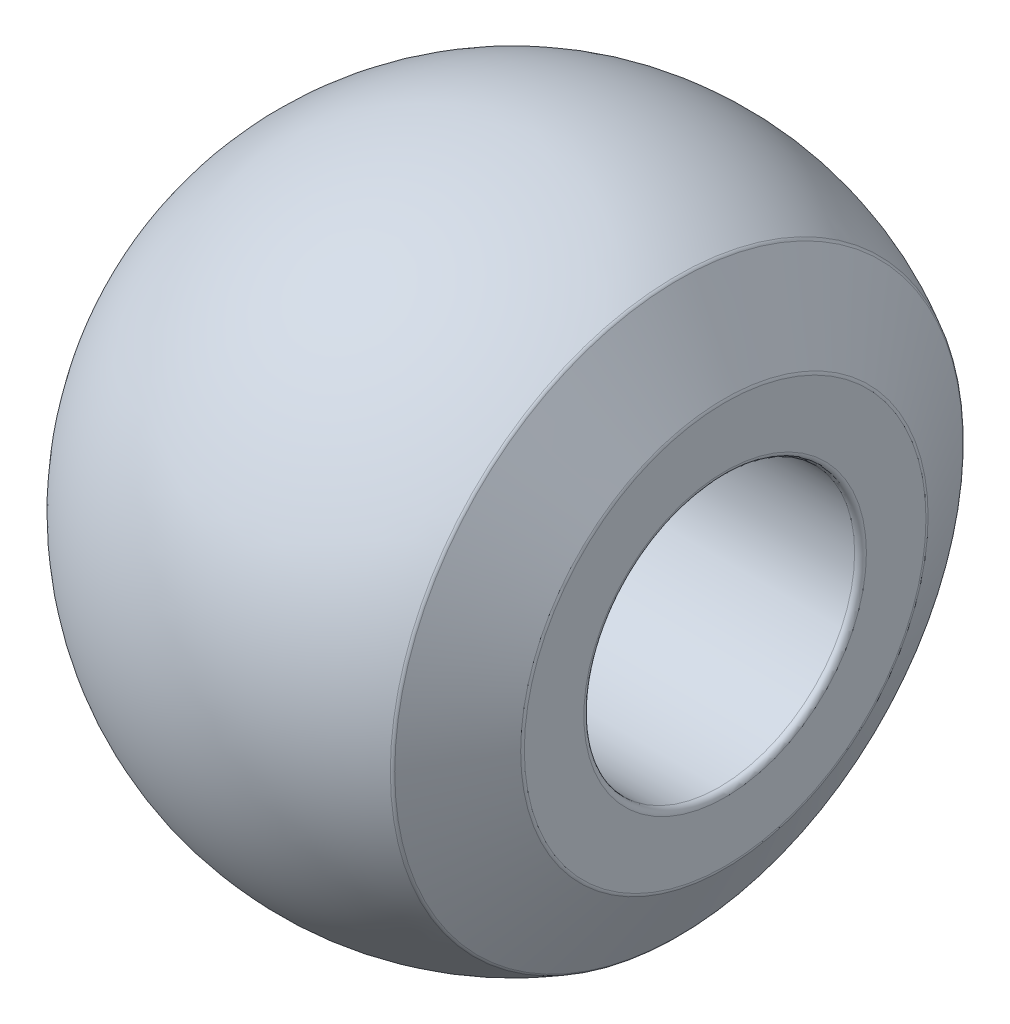
ISO-10303-21;
HEADER;
FILE_DESCRIPTION(('STEP AP214'),'2;1');
FILE_NAME('part.step','',(''),(''),'','','');
FILE_SCHEMA(('AUTOMOTIVE_DESIGN { 1 0 10303 214 1 1 1 1 }'));
ENDSEC;
DATA;
#1=APPLICATION_CONTEXT('core data for automotive mechanical design processes');
#2=APPLICATION_PROTOCOL_DEFINITION('international standard','automotive_design',2000,#1);
#3=PRODUCT_CONTEXT('',#1,'mechanical');
#4=PRODUCT('Part','Part','',(#3));
#5=PRODUCT_RELATED_PRODUCT_CATEGORY('part','',(#4));
#6=PRODUCT_DEFINITION_FORMATION('','',#4);
#7=PRODUCT_DEFINITION_CONTEXT('part definition',#1,'design');
#8=PRODUCT_DEFINITION('design','',#6,#7);
#9=PRODUCT_DEFINITION_SHAPE('','',#8);
#10=(LENGTH_UNIT() NAMED_UNIT(*) SI_UNIT(.MILLI.,.METRE.));
#11=(NAMED_UNIT(*) PLANE_ANGLE_UNIT() SI_UNIT($,.RADIAN.));
#12=(NAMED_UNIT(*) SI_UNIT($,.STERADIAN.) SOLID_ANGLE_UNIT());
#13=UNCERTAINTY_MEASURE_WITH_UNIT(LENGTH_MEASURE(1.E-05),#10,'distance_accuracy_value','');
#14=(GEOMETRIC_REPRESENTATION_CONTEXT(3) GLOBAL_UNCERTAINTY_ASSIGNED_CONTEXT((#13)) GLOBAL_UNIT_ASSIGNED_CONTEXT((#10,
#11,#12)) REPRESENTATION_CONTEXT('',''));
#15=CARTESIAN_POINT('',(0.,0.,0.));
#16=DIRECTION('',(0.,0.,1.));
#17=DIRECTION('',(1.,0.,0.));
#18=AXIS2_PLACEMENT_3D('',#15,#16,#17);
#19=CARTESIAN_POINT('',(9.,0.,0.));
#20=DIRECTION('',(1.,0.,0.));
#21=DIRECTION('',(0.,0.,-1.));
#22=AXIS2_PLACEMENT_3D('',#19,#20,#21);
#23=PLANE('',#22);
#24=CARTESIAN_POINT('',(9.,0.,0.));
#25=DIRECTION('',(1.,0.,0.));
#26=DIRECTION('',(0.,0.,-1.));
#27=AXIS2_PLACEMENT_3D('',#24,#25,#26);
#28=CIRCLE('',#27,8.52841342603333);
#29=CARTESIAN_POINT('',(9.,0.,-8.52841342603333));
#30=VERTEX_POINT('',#29);
#31=EDGE_CURVE('E47',#30,#30,#28,.T.);
#32=ORIENTED_EDGE('',*,*,#31,.T.);
#33=EDGE_LOOP('',(#32));
#34=FACE_BOUND('',#33,.T.);
#35=CARTESIAN_POINT('',(9.,0.,0.));
#36=DIRECTION('',(1.,0.,0.));
#37=DIRECTION('',(0.,0.,-1.));
#38=AXIS2_PLACEMENT_3D('',#35,#36,#37);
#39=CIRCLE('',#38,6.);
#40=CARTESIAN_POINT('',(9.,0.,-6.));
#41=VERTEX_POINT('',#40);
#42=EDGE_CURVE('E52',#41,#41,#39,.F.);
#43=ORIENTED_EDGE('',*,*,#42,.T.);
#44=EDGE_LOOP('',(#43));
#45=FACE_BOUND('',#44,.T.);
#46=ADVANCED_FACE('F39',(#34,#45),#23,.T.);
#47=CARTESIAN_POINT('',(-2.,0.,0.));
#48=DIRECTION('',(1.,0.,0.));
#49=DIRECTION('',(0.,0.,-1.));
#50=AXIS2_PLACEMENT_3D('',#47,#48,#49);
#51=CYLINDRICAL_SURFACE('',#50,5.75);
#52=CARTESIAN_POINT('',(8.75,0.,0.));
#53=DIRECTION('',(1.,0.,0.));
#54=DIRECTION('',(0.,0.,-1.));
#55=AXIS2_PLACEMENT_3D('',#52,#53,#54);
#56=CIRCLE('',#55,5.75);
#57=CARTESIAN_POINT('',(8.75,0.,-5.75));
#58=VERTEX_POINT('',#57);
#59=EDGE_CURVE('E10',#58,#58,#56,.T.);
#60=ORIENTED_EDGE('',*,*,#59,.T.);
#61=EDGE_LOOP('',(#60));
#62=FACE_BOUND('',#61,.T.);
#63=CARTESIAN_POINT('',(-2.,0.,0.));
#64=DIRECTION('',(1.,0.,0.));
#65=DIRECTION('',(0.,0.,-1.));
#66=AXIS2_PLACEMENT_3D('',#63,#64,#65);
#67=CIRCLE('',#66,5.75);
#68=CARTESIAN_POINT('',(-2.,0.,-5.75));
#69=VERTEX_POINT('',#68);
#70=EDGE_CURVE('E71',#69,#69,#67,.T.);
#71=ORIENTED_EDGE('',*,*,#70,.F.);
#72=EDGE_LOOP('',(#71));
#73=FACE_BOUND('',#72,.T.);
#74=ADVANCED_FACE('F78',(#62,#73),#51,.F.);
#75=CARTESIAN_POINT('',(-2.,0.,0.));
#76=DIRECTION('',(1.,0.,0.));
#77=DIRECTION('',(0.,0.,-1.));
#78=AXIS2_PLACEMENT_3D('',#75,#76,#77);
#79=PLANE('',#78);
#80=ORIENTED_EDGE('',*,*,#70,.T.);
#81=EDGE_LOOP('',(#80));
#82=FACE_BOUND('',#81,.T.);
#83=ADVANCED_FACE('F76',(#82),#79,.T.);
#84=CARTESIAN_POINT('',(9.62,0.,0.));
#85=DIRECTION('',(-1.,0.,0.));
#86=DIRECTION('',(0.,0.,1.));
#87=AXIS2_PLACEMENT_3D('',#84,#85,#86);
#88=CONICAL_SURFACE('',#87,7.5,1.05532396062664);
#89=CARTESIAN_POINT('',(7.03372087280998,0.,0.));
#90=DIRECTION('',(-1.,0.,0.));
#91=DIRECTION('',(0.,0.,1.));
#92=AXIS2_PLACEMENT_3D('',#89,#90,#91);
#93=CIRCLE('',#92,12.0648375961874);
#94=CARTESIAN_POINT('',(7.03372087280998,0.,12.0648375961874));
#95=VERTEX_POINT('',#94);
#96=EDGE_CURVE('E57',#95,#95,#93,.F.);
#97=ORIENTED_EDGE('',*,*,#96,.T.);
#98=EDGE_LOOP('',(#97));
#99=FACE_BOUND('',#98,.T.);
#100=CARTESIAN_POINT('',(8.96751499210331,0.,0.));
#101=DIRECTION('',(-1.,0.,0.));
#102=DIRECTION('',(0.,0.,1.));
#103=AXIS2_PLACEMENT_3D('',#100,#101,#102);
#104=CIRCLE('',#103,8.65164989876076);
#105=CARTESIAN_POINT('',(8.96751499210331,0.,8.65164989876076));
#106=VERTEX_POINT('',#105);
#107=EDGE_CURVE('E63',#106,#106,#104,.T.);
#108=ORIENTED_EDGE('',*,*,#107,.T.);
#109=EDGE_LOOP('',(#108));
#110=FACE_BOUND('',#109,.T.);
#111=ADVANCED_FACE('F85',(#99,#110),#88,.T.);
#112=CARTESIAN_POINT('',(0.,0.,0.));
#113=DIRECTION('',(0.,0.,-1.));
#114=DIRECTION('',(1.,0.,0.));
#115=AXIS2_PLACEMENT_3D('',#112,#113,#114);
#116=SPHERICAL_SURFACE('',#115,14.);
#117=CARTESIAN_POINT('',(0.,0.,0.));
#118=DIRECTION('',(-1.,0.,0.));
#119=DIRECTION('',(0.,0.,1.));
#120=AXIS2_PLACEMENT_3D('',#117,#118,#119);
#121=SPHERICAL_SURFACE('',#120,14.);
#122=CARTESIAN_POINT('',(6.94013689671952,0.,0.));
#123=DIRECTION('',(-1.,0.,0.));
#124=DIRECTION('',(0.,0.,1.));
#125=AXIS2_PLACEMENT_3D('',#122,#123,#124);
#126=CIRCLE('',#125,12.1587211438865);
#127=CARTESIAN_POINT('',(6.94013689671952,0.,12.1587211438865));
#128=VERTEX_POINT('',#127);
#129=EDGE_CURVE('E67',#128,#128,#126,.T.);
#130=ORIENTED_EDGE('',*,*,#129,.T.);
#131=EDGE_LOOP('',(#130));
#132=FACE_BOUND('',#131,.T.);
#133=ADVANCED_FACE('F90',(#132),#121,.T.);
#134=CARTESIAN_POINT('',(6.81620588070667,0.,0.));
#135=DIRECTION('',(1.,0.,0.));
#136=DIRECTION('',(0.,0.,-1.));
#137=AXIS2_PLACEMENT_3D('',#134,#135,#136);
#138=TOROIDAL_SURFACE('',#137,11.9416011234599,0.25);
#139=ORIENTED_EDGE('',*,*,#96,.F.);
#140=EDGE_LOOP('',(#139));
#141=FACE_BOUND('',#140,.T.);
#142=ORIENTED_EDGE('',*,*,#129,.F.);
#143=EDGE_LOOP('',(#142));
#144=FACE_BOUND('',#143,.T.);
#145=ADVANCED_FACE('F93',(#141,#144),#138,.T.);
#146=CARTESIAN_POINT('',(8.75,0.,0.));
#147=DIRECTION('',(1.,0.,0.));
#148=DIRECTION('',(0.,0.,-1.));
#149=AXIS2_PLACEMENT_3D('',#146,#147,#148);
#150=TOROIDAL_SURFACE('',#149,8.52841342603333,0.25);
#151=ORIENTED_EDGE('',*,*,#31,.F.);
#152=EDGE_LOOP('',(#151));
#153=FACE_BOUND('',#152,.T.);
#154=ORIENTED_EDGE('',*,*,#107,.F.);
#155=EDGE_LOOP('',(#154));
#156=FACE_BOUND('',#155,.T.);
#157=ADVANCED_FACE('F96',(#153,#156),#150,.T.);
#158=CARTESIAN_POINT('',(8.75,0.,0.));
#159=DIRECTION('',(1.,0.,0.));
#160=DIRECTION('',(0.,0.,-1.));
#161=AXIS2_PLACEMENT_3D('',#158,#159,#160);
#162=TOROIDAL_SURFACE('',#161,6.,0.25);
#163=ORIENTED_EDGE('',*,*,#42,.F.);
#164=EDGE_LOOP('',(#163));
#165=FACE_BOUND('',#164,.T.);
#166=ORIENTED_EDGE('',*,*,#59,.F.);
#167=EDGE_LOOP('',(#166));
#168=FACE_BOUND('',#167,.T.);
#169=ADVANCED_FACE('F41',(#165,#168),#162,.T.);
#170=CLOSED_SHELL('',(#46,#74,#83,#111,#133,#145,#157,#169));
#171=MANIFOLD_SOLID_BREP('B2',#170);
#172=ADVANCED_BREP_SHAPE_REPRESENTATION('',(#18,#171),#14);
#173=SHAPE_DEFINITION_REPRESENTATION(#9,#172);
ENDSEC;
END-ISO-10303-21;
